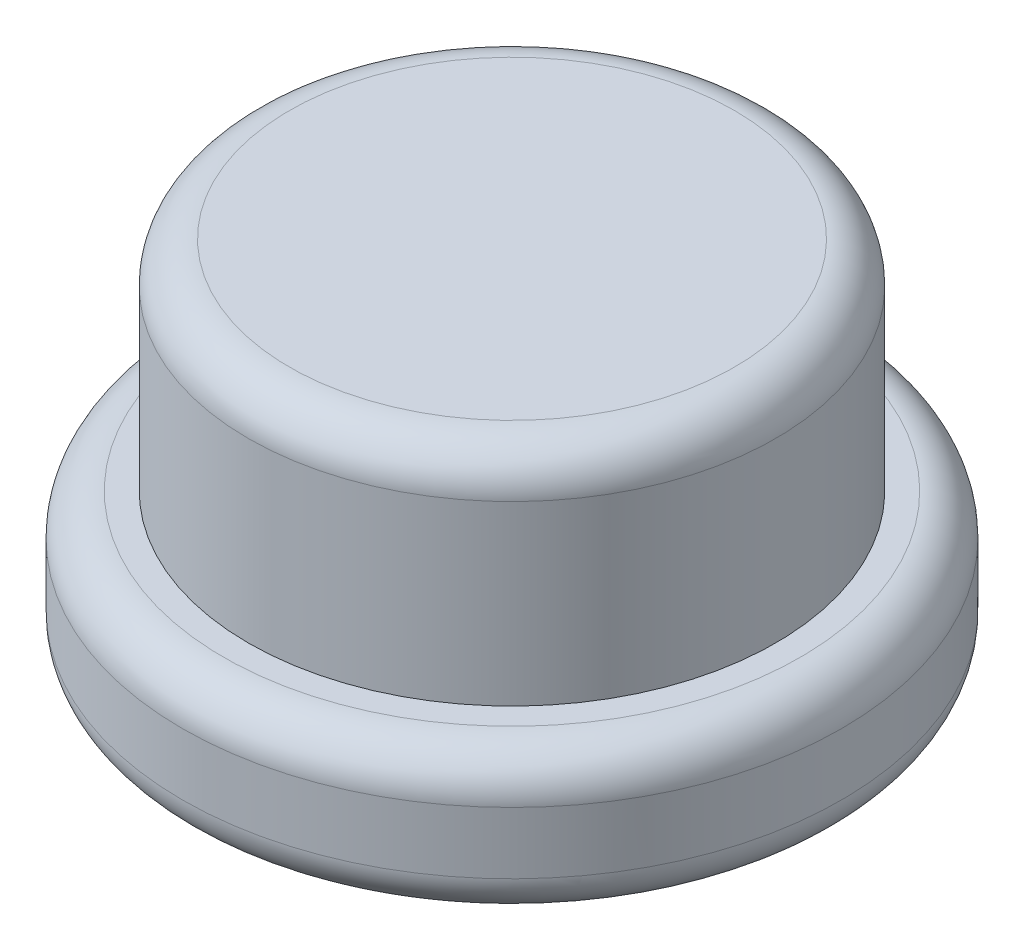
ISO-10303-21;
HEADER;
FILE_DESCRIPTION(('STEP AP214'),'2;1');
FILE_NAME('part.step','',(''),(''),'','','');
FILE_SCHEMA(('AUTOMOTIVE_DESIGN { 1 0 10303 214 1 1 1 1 }'));
ENDSEC;
DATA;
#1=APPLICATION_CONTEXT('core data for automotive mechanical design processes');
#2=APPLICATION_PROTOCOL_DEFINITION('international standard','automotive_design',2000,#1);
#3=PRODUCT_CONTEXT('',#1,'mechanical');
#4=PRODUCT('Part','Part','',(#3));
#5=PRODUCT_RELATED_PRODUCT_CATEGORY('part','',(#4));
#6=PRODUCT_DEFINITION_FORMATION('','',#4);
#7=PRODUCT_DEFINITION_CONTEXT('part definition',#1,'design');
#8=PRODUCT_DEFINITION('design','',#6,#7);
#9=PRODUCT_DEFINITION_SHAPE('','',#8);
#10=(LENGTH_UNIT() NAMED_UNIT(*) SI_UNIT(.MILLI.,.METRE.));
#11=(NAMED_UNIT(*) PLANE_ANGLE_UNIT() SI_UNIT($,.RADIAN.));
#12=(NAMED_UNIT(*) SI_UNIT($,.STERADIAN.) SOLID_ANGLE_UNIT());
#13=UNCERTAINTY_MEASURE_WITH_UNIT(LENGTH_MEASURE(1.E-05),#10,'distance_accuracy_value','');
#14=(GEOMETRIC_REPRESENTATION_CONTEXT(3) GLOBAL_UNCERTAINTY_ASSIGNED_CONTEXT((#13)) GLOBAL_UNIT_ASSIGNED_CONTEXT((#10,
#11,#12)) REPRESENTATION_CONTEXT('',''));
#15=CARTESIAN_POINT('',(0.,0.,0.));
#16=DIRECTION('',(0.,0.,1.));
#17=DIRECTION('',(1.,0.,0.));
#18=AXIS2_PLACEMENT_3D('',#15,#16,#17);
#19=CARTESIAN_POINT('',(0.,4.35,0.));
#20=DIRECTION('',(0.,1.,0.));
#21=DIRECTION('',(-1.,0.,0.));
#22=AXIS2_PLACEMENT_3D('',#19,#20,#21);
#23=SPHERICAL_SURFACE('',#22,4.35);
#24=CARTESIAN_POINT('',(0.,1.2,0.));
#25=DIRECTION('',(0.,1.,0.));
#26=DIRECTION('',(0.,0.,1.));
#27=AXIS2_PLACEMENT_3D('',#24,#25,#26);
#28=CIRCLE('',#27,3.);
#29=CARTESIAN_POINT('',(0.,1.2,3.));
#30=VERTEX_POINT('',#29);
#31=EDGE_CURVE('E56',#30,#30,#28,.T.);
#32=ORIENTED_EDGE('',*,*,#31,.F.);
#33=EDGE_LOOP('',(#32));
#34=FACE_BOUND('',#33,.T.);
#35=ADVANCED_FACE('F30',(#34),#23,.T.);
#36=CARTESIAN_POINT('',(3.,1.2,0.));
#37=DIRECTION('',(0.,1.,0.));
#38=DIRECTION('',(0.,0.,1.));
#39=AXIS2_PLACEMENT_3D('',#36,#37,#38);
#40=PLANE('',#39);
#41=CARTESIAN_POINT('',(0.,1.2,0.));
#42=DIRECTION('',(0.,1.,0.));
#43=DIRECTION('',(0.,0.,1.));
#44=AXIS2_PLACEMENT_3D('',#41,#42,#43);
#45=CIRCLE('',#44,7.);
#46=CARTESIAN_POINT('',(0.,1.2,7.));
#47=VERTEX_POINT('',#46);
#48=EDGE_CURVE('E45',#47,#47,#45,.F.);
#49=ORIENTED_EDGE('',*,*,#48,.T.);
#50=EDGE_LOOP('',(#49));
#51=FACE_BOUND('',#50,.T.);
#52=ORIENTED_EDGE('',*,*,#31,.T.);
#53=EDGE_LOOP('',(#52));
#54=FACE_BOUND('',#53,.T.);
#55=ADVANCED_FACE('F76',(#51,#54),#40,.F.);
#56=CARTESIAN_POINT('',(0.,10.,0.));
#57=DIRECTION('',(0.,1.,0.));
#58=DIRECTION('',(0.,0.,1.));
#59=AXIS2_PLACEMENT_3D('',#56,#57,#58);
#60=CYLINDRICAL_SURFACE('',#59,8.);
#61=CARTESIAN_POINT('',(0.,2.2,0.));
#62=DIRECTION('',(0.,1.,0.));
#63=DIRECTION('',(0.,0.,1.));
#64=AXIS2_PLACEMENT_3D('',#61,#62,#63);
#65=CIRCLE('',#64,8.);
#66=CARTESIAN_POINT('',(0.,2.2,8.));
#67=VERTEX_POINT('',#66);
#68=EDGE_CURVE('E50',#67,#67,#65,.T.);
#69=ORIENTED_EDGE('',*,*,#68,.T.);
#70=EDGE_LOOP('',(#69));
#71=FACE_BOUND('',#70,.T.);
#72=CARTESIAN_POINT('',(0.,3.7,0.));
#73=DIRECTION('',(0.,-1.,0.));
#74=DIRECTION('',(0.,0.,-1.));
#75=AXIS2_PLACEMENT_3D('',#72,#73,#74);
#76=CIRCLE('',#75,8.);
#77=CARTESIAN_POINT('',(0.,3.7,-8.));
#78=VERTEX_POINT('',#77);
#79=EDGE_CURVE('E53',#78,#78,#76,.T.);
#80=ORIENTED_EDGE('',*,*,#79,.T.);
#81=EDGE_LOOP('',(#80));
#82=FACE_BOUND('',#81,.T.);
#83=ADVANCED_FACE('F67',(#71,#82),#60,.T.);
#84=CARTESIAN_POINT('',(8.,4.7,0.));
#85=DIRECTION('',(0.,-1.,0.));
#86=DIRECTION('',(0.,0.,-1.));
#87=AXIS2_PLACEMENT_3D('',#84,#85,#86);
#88=PLANE('',#87);
#89=CARTESIAN_POINT('',(0.,4.7,0.));
#90=DIRECTION('',(0.,-1.,0.));
#91=DIRECTION('',(0.,0.,-1.));
#92=AXIS2_PLACEMENT_3D('',#89,#90,#91);
#93=CIRCLE('',#92,7.);
#94=CARTESIAN_POINT('',(0.,4.7,-7.));
#95=VERTEX_POINT('',#94);
#96=EDGE_CURVE('E41',#95,#95,#93,.F.);
#97=ORIENTED_EDGE('',*,*,#96,.T.);
#98=EDGE_LOOP('',(#97));
#99=FACE_BOUND('',#98,.T.);
#100=CARTESIAN_POINT('',(0.,4.7,0.));
#101=DIRECTION('',(0.,1.,0.));
#102=DIRECTION('',(0.,0.,1.));
#103=AXIS2_PLACEMENT_3D('',#100,#101,#102);
#104=CIRCLE('',#103,6.4);
#105=CARTESIAN_POINT('',(0.,4.7,6.4));
#106=VERTEX_POINT('',#105);
#107=EDGE_CURVE('E59',#106,#106,#104,.T.);
#108=ORIENTED_EDGE('',*,*,#107,.F.);
#109=EDGE_LOOP('',(#108));
#110=FACE_BOUND('',#109,.T.);
#111=ADVANCED_FACE('F65',(#99,#110),#88,.F.);
#112=CARTESIAN_POINT('',(0.,10.,0.));
#113=DIRECTION('',(0.,1.,0.));
#114=DIRECTION('',(0.,0.,1.));
#115=AXIS2_PLACEMENT_3D('',#112,#113,#114);
#116=CYLINDRICAL_SURFACE('',#115,6.4);
#117=CARTESIAN_POINT('',(0.,9.,0.));
#118=DIRECTION('',(0.,-1.,0.));
#119=DIRECTION('',(0.,0.,-1.));
#120=AXIS2_PLACEMENT_3D('',#117,#118,#119);
#121=CIRCLE('',#120,6.4);
#122=CARTESIAN_POINT('',(0.,9.,-6.4));
#123=VERTEX_POINT('',#122);
#124=EDGE_CURVE('E10',#123,#123,#121,.T.);
#125=ORIENTED_EDGE('',*,*,#124,.T.);
#126=EDGE_LOOP('',(#125));
#127=FACE_BOUND('',#126,.T.);
#128=ORIENTED_EDGE('',*,*,#107,.T.);
#129=EDGE_LOOP('',(#128));
#130=FACE_BOUND('',#129,.T.);
#131=ADVANCED_FACE('F63',(#127,#130),#116,.T.);
#132=CARTESIAN_POINT('',(6.4,10.,0.));
#133=DIRECTION('',(0.,-1.,0.));
#134=DIRECTION('',(0.,0.,-1.));
#135=AXIS2_PLACEMENT_3D('',#132,#133,#134);
#136=PLANE('',#135);
#137=CARTESIAN_POINT('',(0.,10.,0.));
#138=DIRECTION('',(0.,-1.,0.));
#139=DIRECTION('',(0.,0.,-1.));
#140=AXIS2_PLACEMENT_3D('',#137,#138,#139);
#141=CIRCLE('',#140,5.4);
#142=CARTESIAN_POINT('',(0.,10.,-5.4));
#143=VERTEX_POINT('',#142);
#144=EDGE_CURVE('E37',#143,#143,#141,.F.);
#145=ORIENTED_EDGE('',*,*,#144,.T.);
#146=EDGE_LOOP('',(#145));
#147=FACE_BOUND('',#146,.T.);
#148=ADVANCED_FACE('F74',(#147),#136,.F.);
#149=CARTESIAN_POINT('',(0.,2.2,0.));
#150=DIRECTION('',(0.,1.,0.));
#151=DIRECTION('',(0.,0.,1.));
#152=AXIS2_PLACEMENT_3D('',#149,#150,#151);
#153=TOROIDAL_SURFACE('',#152,7.,1.);
#154=ORIENTED_EDGE('',*,*,#48,.F.);
#155=EDGE_LOOP('',(#154));
#156=FACE_BOUND('',#155,.T.);
#157=ORIENTED_EDGE('',*,*,#68,.F.);
#158=EDGE_LOOP('',(#157));
#159=FACE_BOUND('',#158,.T.);
#160=ADVANCED_FACE('F89',(#156,#159),#153,.T.);
#161=CARTESIAN_POINT('',(0.,3.7,0.));
#162=DIRECTION('',(0.,-1.,0.));
#163=DIRECTION('',(0.,0.,-1.));
#164=AXIS2_PLACEMENT_3D('',#161,#162,#163);
#165=TOROIDAL_SURFACE('',#164,7.,1.);
#166=ORIENTED_EDGE('',*,*,#79,.F.);
#167=EDGE_LOOP('',(#166));
#168=FACE_BOUND('',#167,.T.);
#169=ORIENTED_EDGE('',*,*,#96,.F.);
#170=EDGE_LOOP('',(#169));
#171=FACE_BOUND('',#170,.T.);
#172=ADVANCED_FACE('F91',(#168,#171),#165,.T.);
#173=CARTESIAN_POINT('',(0.,9.,0.));
#174=DIRECTION('',(0.,-1.,0.));
#175=DIRECTION('',(0.,0.,-1.));
#176=AXIS2_PLACEMENT_3D('',#173,#174,#175);
#177=TOROIDAL_SURFACE('',#176,5.4,1.);
#178=ORIENTED_EDGE('',*,*,#124,.F.);
#179=EDGE_LOOP('',(#178));
#180=FACE_BOUND('',#179,.T.);
#181=ORIENTED_EDGE('',*,*,#144,.F.);
#182=EDGE_LOOP('',(#181));
#183=FACE_BOUND('',#182,.T.);
#184=ADVANCED_FACE('F32',(#180,#183),#177,.T.);
#185=CLOSED_SHELL('',(#35,#55,#83,#111,#131,#148,#160,#172,#184));
#186=MANIFOLD_SOLID_BREP('B2',#185);
#187=ADVANCED_BREP_SHAPE_REPRESENTATION('',(#18,#186),#14);
#188=SHAPE_DEFINITION_REPRESENTATION(#9,#187);
ENDSEC;
END-ISO-10303-21;
